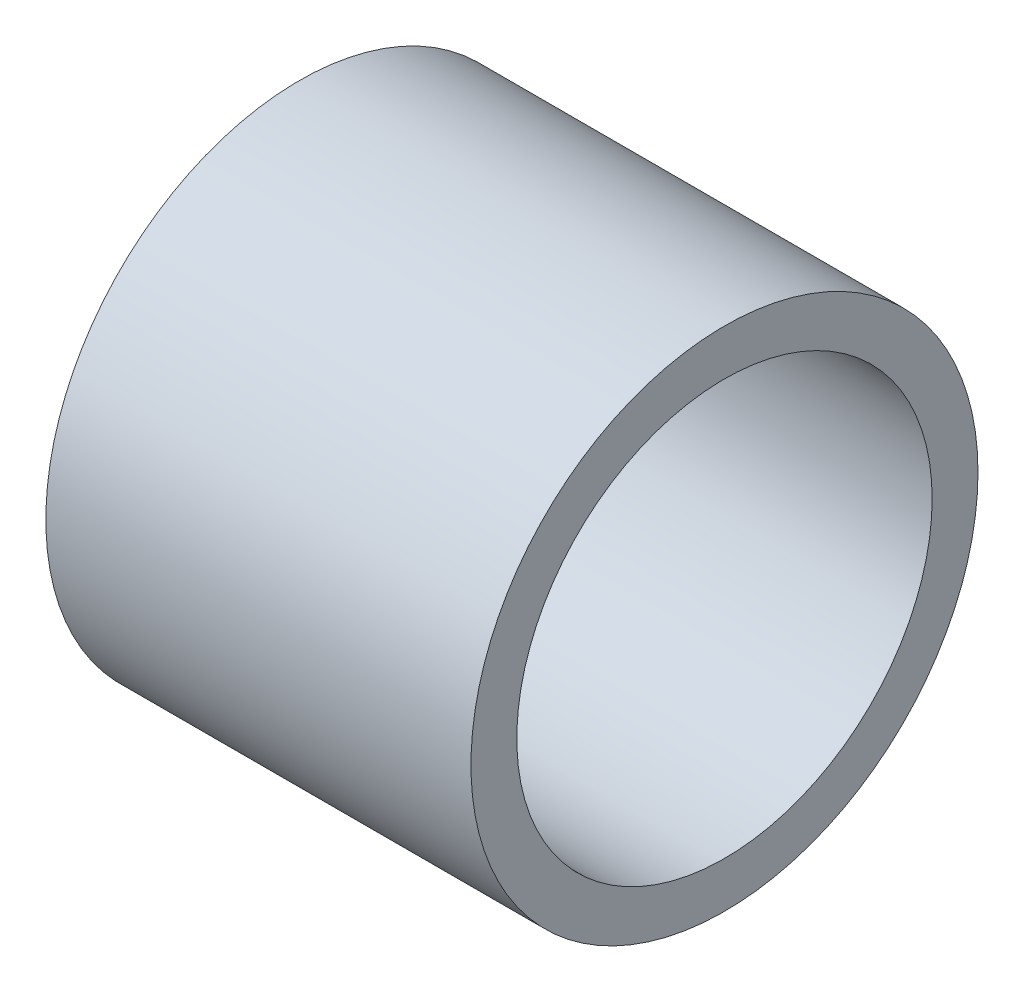
ISO-10303-21;
HEADER;
FILE_DESCRIPTION(('STEP AP214'),'2;1');
FILE_NAME('part.step','',(''),(''),'','','');
FILE_SCHEMA(('AUTOMOTIVE_DESIGN { 1 0 10303 214 1 1 1 1 }'));
ENDSEC;
DATA;
#1=APPLICATION_CONTEXT('core data for automotive mechanical design processes');
#2=APPLICATION_PROTOCOL_DEFINITION('international standard','automotive_design',2000,#1);
#3=PRODUCT_CONTEXT('',#1,'mechanical');
#4=PRODUCT('Part','Part','',(#3));
#5=PRODUCT_RELATED_PRODUCT_CATEGORY('part','',(#4));
#6=PRODUCT_DEFINITION_FORMATION('','',#4);
#7=PRODUCT_DEFINITION_CONTEXT('part definition',#1,'design');
#8=PRODUCT_DEFINITION('design','',#6,#7);
#9=PRODUCT_DEFINITION_SHAPE('','',#8);
#10=(LENGTH_UNIT() NAMED_UNIT(*) SI_UNIT(.MILLI.,.METRE.));
#11=(NAMED_UNIT(*) PLANE_ANGLE_UNIT() SI_UNIT($,.RADIAN.));
#12=(NAMED_UNIT(*) SI_UNIT($,.STERADIAN.) SOLID_ANGLE_UNIT());
#13=UNCERTAINTY_MEASURE_WITH_UNIT(LENGTH_MEASURE(1.E-05),#10,'distance_accuracy_value','');
#14=(GEOMETRIC_REPRESENTATION_CONTEXT(3) GLOBAL_UNCERTAINTY_ASSIGNED_CONTEXT((#13)) GLOBAL_UNIT_ASSIGNED_CONTEXT((#10,
#11,#12)) REPRESENTATION_CONTEXT('',''));
#15=CARTESIAN_POINT('',(0.,0.,0.));
#16=DIRECTION('',(0.,0.,1.));
#17=DIRECTION('',(1.,0.,0.));
#18=AXIS2_PLACEMENT_3D('',#15,#16,#17);
#19=CARTESIAN_POINT('',(3.3274,0.,0.));
#20=DIRECTION('',(1.,0.,0.));
#21=DIRECTION('',(0.,0.,-1.));
#22=AXIS2_PLACEMENT_3D('',#19,#20,#21);
#23=PLANE('',#22);
#24=CARTESIAN_POINT('',(3.3274,0.,0.));
#25=DIRECTION('',(1.,0.,0.));
#26=DIRECTION('',(0.,0.,-1.));
#27=AXIS2_PLACEMENT_3D('',#24,#25,#26);
#28=CIRCLE('',#27,1.984375);
#29=CARTESIAN_POINT('',(3.3274,0.,-1.984375));
#30=VERTEX_POINT('',#29);
#31=EDGE_CURVE('E10',#30,#30,#28,.T.);
#32=ORIENTED_EDGE('',*,*,#31,.T.);
#33=EDGE_LOOP('',(#32));
#34=FACE_BOUND('',#33,.T.);
#35=CARTESIAN_POINT('',(3.3274,0.,0.));
#36=DIRECTION('',(1.,0.,0.));
#37=DIRECTION('',(0.,0.,-1.));
#38=AXIS2_PLACEMENT_3D('',#35,#36,#37);
#39=CIRCLE('',#38,1.6256);
#40=CARTESIAN_POINT('',(3.3274,0.,-1.6256));
#41=VERTEX_POINT('',#40);
#42=EDGE_CURVE('E42',#41,#41,#39,.T.);
#43=ORIENTED_EDGE('',*,*,#42,.F.);
#44=EDGE_LOOP('',(#43));
#45=FACE_BOUND('',#44,.T.);
#46=ADVANCED_FACE('F31',(#34,#45),#23,.T.);
#47=CARTESIAN_POINT('',(0.,0.,0.));
#48=DIRECTION('',(1.,0.,0.));
#49=DIRECTION('',(0.,0.,-1.));
#50=AXIS2_PLACEMENT_3D('',#47,#48,#49);
#51=PLANE('',#50);
#52=CARTESIAN_POINT('',(0.,0.,0.));
#53=DIRECTION('',(1.,0.,0.));
#54=DIRECTION('',(0.,0.,-1.));
#55=AXIS2_PLACEMENT_3D('',#52,#53,#54);
#56=CIRCLE('',#55,1.984375);
#57=CARTESIAN_POINT('',(0.,0.,-1.984375));
#58=VERTEX_POINT('',#57);
#59=EDGE_CURVE('E35',#58,#58,#56,.T.);
#60=ORIENTED_EDGE('',*,*,#59,.F.);
#61=EDGE_LOOP('',(#60));
#62=FACE_BOUND('',#61,.T.);
#63=CARTESIAN_POINT('',(0.,0.,0.));
#64=DIRECTION('',(1.,0.,0.));
#65=DIRECTION('',(0.,0.,-1.));
#66=AXIS2_PLACEMENT_3D('',#63,#64,#65);
#67=CIRCLE('',#66,1.6256);
#68=CARTESIAN_POINT('',(0.,0.,-1.6256));
#69=VERTEX_POINT('',#68);
#70=EDGE_CURVE('E44',#69,#69,#67,.T.);
#71=ORIENTED_EDGE('',*,*,#70,.T.);
#72=EDGE_LOOP('',(#71));
#73=FACE_BOUND('',#72,.T.);
#74=ADVANCED_FACE('F54',(#62,#73),#51,.F.);
#75=CARTESIAN_POINT('',(3.3274,0.,0.));
#76=DIRECTION('',(-1.,0.,0.));
#77=DIRECTION('',(0.,0.,1.));
#78=AXIS2_PLACEMENT_3D('',#75,#76,#77);
#79=CYLINDRICAL_SURFACE('',#78,1.984375);
#80=ORIENTED_EDGE('',*,*,#31,.F.);
#81=EDGE_LOOP('',(#80));
#82=FACE_BOUND('',#81,.T.);
#83=ORIENTED_EDGE('',*,*,#59,.T.);
#84=EDGE_LOOP('',(#83));
#85=FACE_BOUND('',#84,.T.);
#86=ADVANCED_FACE('F33',(#82,#85),#79,.T.);
#87=CARTESIAN_POINT('',(3.3274,0.,0.));
#88=DIRECTION('',(-1.,0.,0.));
#89=DIRECTION('',(0.,0.,1.));
#90=AXIS2_PLACEMENT_3D('',#87,#88,#89);
#91=CYLINDRICAL_SURFACE('',#90,1.6256);
#92=ORIENTED_EDGE('',*,*,#42,.T.);
#93=EDGE_LOOP('',(#92));
#94=FACE_BOUND('',#93,.T.);
#95=ORIENTED_EDGE('',*,*,#70,.F.);
#96=EDGE_LOOP('',(#95));
#97=FACE_BOUND('',#96,.T.);
#98=ADVANCED_FACE('F50',(#94,#97),#91,.F.);
#99=CLOSED_SHELL('',(#46,#74,#86,#98));
#100=MANIFOLD_SOLID_BREP('B2',#99);
#101=ADVANCED_BREP_SHAPE_REPRESENTATION('',(#18,#100),#14);
#102=SHAPE_DEFINITION_REPRESENTATION(#9,#101);
ENDSEC;
END-ISO-10303-21;
